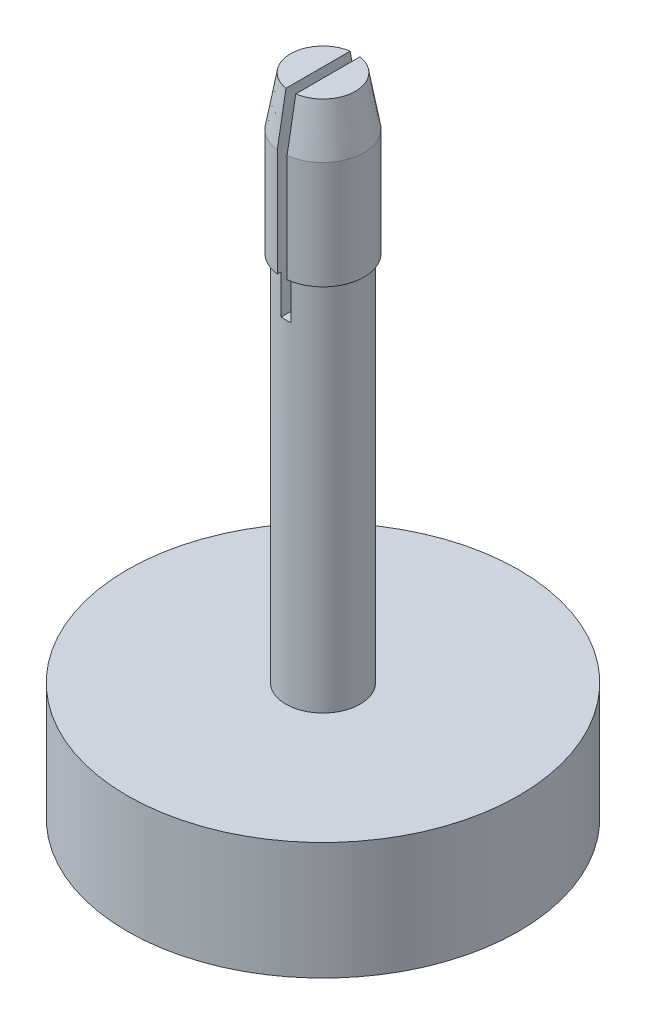
ISO-10303-21;
HEADER;
FILE_DESCRIPTION(('STEP AP214'),'2;1');
FILE_NAME('part.step','',(''),(''),'','','');
FILE_SCHEMA(('AUTOMOTIVE_DESIGN { 1 0 10303 214 1 1 1 1 }'));
ENDSEC;
DATA;
#1=APPLICATION_CONTEXT('core data for automotive mechanical design processes');
#2=APPLICATION_PROTOCOL_DEFINITION('international standard','automotive_design',2000,#1);
#3=PRODUCT_CONTEXT('',#1,'mechanical');
#4=PRODUCT('Part','Part','',(#3));
#5=PRODUCT_RELATED_PRODUCT_CATEGORY('part','',(#4));
#6=PRODUCT_DEFINITION_FORMATION('','',#4);
#7=PRODUCT_DEFINITION_CONTEXT('part definition',#1,'design');
#8=PRODUCT_DEFINITION('design','',#6,#7);
#9=PRODUCT_DEFINITION_SHAPE('','',#8);
#10=(LENGTH_UNIT() NAMED_UNIT(*) SI_UNIT(.MILLI.,.METRE.));
#11=(NAMED_UNIT(*) PLANE_ANGLE_UNIT() SI_UNIT($,.RADIAN.));
#12=(NAMED_UNIT(*) SI_UNIT($,.STERADIAN.) SOLID_ANGLE_UNIT());
#13=UNCERTAINTY_MEASURE_WITH_UNIT(LENGTH_MEASURE(1.E-05),#10,'distance_accuracy_value','');
#14=(GEOMETRIC_REPRESENTATION_CONTEXT(3) GLOBAL_UNCERTAINTY_ASSIGNED_CONTEXT((#13)) GLOBAL_UNIT_ASSIGNED_CONTEXT((#10,
#11,#12)) REPRESENTATION_CONTEXT('',''));
#15=CARTESIAN_POINT('',(0.,0.,0.));
#16=DIRECTION('',(0.,0.,1.));
#17=DIRECTION('',(1.,0.,0.));
#18=AXIS2_PLACEMENT_3D('',#15,#16,#17);
#19=CARTESIAN_POINT('',(0.,16.5,0.));
#20=DIRECTION('',(0.,-1.,0.));
#21=DIRECTION('',(0.,0.,-1.));
#22=AXIS2_PLACEMENT_3D('',#19,#20,#21);
#23=CYLINDRICAL_SURFACE('',#22,1.05);
#24=CARTESIAN_POINT('',(0.,15.25,0.));
#25=DIRECTION('',(0.,1.,0.));
#26=DIRECTION('',(0.,0.,1.));
#27=AXIS2_PLACEMENT_3D('',#24,#25,#26);
#28=CIRCLE('',#27,1.05);
#29=CARTESIAN_POINT('',(-0.125,15.25,1.04253297309965));
#30=VERTEX_POINT('',#29);
#31=CARTESIAN_POINT('',(-0.125,15.25,-1.04253297309965));
#32=VERTEX_POINT('',#31);
#33=EDGE_CURVE('E155',#30,#32,#28,.F.);
#34=ORIENTED_EDGE('',*,*,#33,.T.);
#35=DIRECTION('',(0.,-1.,0.));
#36=VECTOR('',#35,1.);
#37=CARTESIAN_POINT('',(-0.125,16.5,-1.04253297309965));
#38=LINE('',#37,#36);
#39=CARTESIAN_POINT('',(-0.125,12.5,-1.04253297309965));
#40=VERTEX_POINT('',#39);
#41=EDGE_CURVE('E123',#32,#40,#38,.T.);
#42=ORIENTED_EDGE('',*,*,#41,.T.);
#43=CARTESIAN_POINT('',(0.,12.5,0.));
#44=DIRECTION('',(0.,1.,0.));
#45=DIRECTION('',(0.,0.,1.));
#46=AXIS2_PLACEMENT_3D('',#43,#44,#45);
#47=CIRCLE('',#46,1.05);
#48=CARTESIAN_POINT('',(-0.125,12.5,1.04253297309965));
#49=VERTEX_POINT('',#48);
#50=EDGE_CURVE('E249',#40,#49,#47,.T.);
#51=ORIENTED_EDGE('',*,*,#50,.T.);
#52=DIRECTION('',(0.,-1.,0.));
#53=VECTOR('',#52,1.);
#54=CARTESIAN_POINT('',(-0.125,16.5,1.04253297309965));
#55=LINE('',#54,#53);
#56=EDGE_CURVE('E244',#49,#30,#55,.F.);
#57=ORIENTED_EDGE('',*,*,#56,.T.);
#58=EDGE_LOOP('',(#34,#42,#51,#57));
#59=FACE_BOUND('',#58,.T.);
#60=ADVANCED_FACE('F39',(#59),#23,.T.);
#61=CARTESIAN_POINT('',(0.,16.5,0.));
#62=DIRECTION('',(0.,1.,0.));
#63=DIRECTION('',(0.,0.,1.));
#64=AXIS2_PLACEMENT_3D('',#61,#62,#63);
#65=PLANE('',#64);
#66=DIRECTION('',(0.,0.,1.));
#67=VECTOR('',#66,1.);
#68=CARTESIAN_POINT('',(-0.125,16.5,-1.5));
#69=LINE('',#68,#67);
#70=CARTESIAN_POINT('',(-0.125,16.5,-0.82011991933301));
#71=VERTEX_POINT('',#70);
#72=CARTESIAN_POINT('',(-0.125,16.5,0.82011991933301));
#73=VERTEX_POINT('',#72);
#74=EDGE_CURVE('E120',#71,#73,#69,.T.);
#75=ORIENTED_EDGE('',*,*,#74,.F.);
#76=CARTESIAN_POINT('',(0.,16.5,0.));
#77=DIRECTION('',(0.,1.,0.));
#78=DIRECTION('',(0.,0.,1.));
#79=AXIS2_PLACEMENT_3D('',#76,#77,#78);
#80=CIRCLE('',#79,0.829591274114418);
#81=EDGE_CURVE('E135',#71,#73,#80,.T.);
#82=ORIENTED_EDGE('',*,*,#81,.T.);
#83=EDGE_LOOP('',(#75,#82));
#84=FACE_BOUND('',#83,.T.);
#85=ADVANCED_FACE('F134',(#84),#65,.T.);
#86=CARTESIAN_POINT('',(0.,12.5,0.));
#87=DIRECTION('',(0.,1.,0.));
#88=DIRECTION('',(0.,0.,1.));
#89=AXIS2_PLACEMENT_3D('',#86,#87,#88);
#90=PLANE('',#89);
#91=ORIENTED_EDGE('',*,*,#50,.F.);
#92=DIRECTION('',(0.,0.,1.));
#93=VECTOR('',#92,1.);
#94=CARTESIAN_POINT('',(-0.125,12.5,0.));
#95=LINE('',#94,#93);
#96=CARTESIAN_POINT('',(-0.125,12.5,-0.941740410091868));
#97=VERTEX_POINT('',#96);
#98=EDGE_CURVE('E239',#40,#97,#95,.T.);
#99=ORIENTED_EDGE('',*,*,#98,.T.);
#100=CARTESIAN_POINT('',(0.,12.5,0.));
#101=DIRECTION('',(0.,1.,0.));
#102=DIRECTION('',(0.,0.,1.));
#103=AXIS2_PLACEMENT_3D('',#100,#101,#102);
#104=CIRCLE('',#103,0.95);
#105=CARTESIAN_POINT('',(-0.125,12.5,0.941740410091868));
#106=VERTEX_POINT('',#105);
#107=EDGE_CURVE('E254',#97,#106,#104,.T.);
#108=ORIENTED_EDGE('',*,*,#107,.T.);
#109=EDGE_CURVE('E64',#106,#49,#95,.T.);
#110=ORIENTED_EDGE('',*,*,#109,.T.);
#111=EDGE_LOOP('',(#91,#99,#108,#110));
#112=FACE_BOUND('',#111,.T.);
#113=ADVANCED_FACE('F285',(#112),#90,.F.);
#114=CARTESIAN_POINT('',(0.,16.5,0.));
#115=DIRECTION('',(0.,-1.,0.));
#116=DIRECTION('',(0.,0.,-1.));
#117=AXIS2_PLACEMENT_3D('',#114,#115,#116);
#118=CONICAL_SURFACE('',#117,0.829591274114418,0.174532925199429);
#119=CARTESIAN_POINT('',(-0.125,18.94406988197,0.378530725252323));
#120=CARTESIAN_POINT('',(-0.125,18.832752243388,0.399192830328894));
#121=CARTESIAN_POINT('',(-0.125,18.721408295903,0.419712228066009));
#122=CARTESIAN_POINT('',(-0.125,18.4986822676716,0.460541771400634));
#123=CARTESIAN_POINT('',(-0.125,18.3873001870088,0.480851917454275));
#124=CARTESIAN_POINT('',(-0.125,18.0531178660346,0.541582833124006));
#125=CARTESIAN_POINT('',(-0.125,17.8302814244017,0.581804102782841));
#126=CARTESIAN_POINT('',(-0.125,17.3845580422133,0.661966043324755));
#127=CARTESIAN_POINT('',(-0.125,17.1616711016276,0.701906714039098));
#128=CARTESIAN_POINT('',(-0.125,16.4929646603575,0.821484275084629));
#129=CARTESIAN_POINT('',(-0.125,16.0471014091611,0.900876377280123));
#130=CARTESIAN_POINT('',(-0.125,15.1353695414359,1.06293655947568));
#131=CARTESIAN_POINT('',(-0.125,14.66949872161,1.14559221954829));
#132=CARTESIAN_POINT('',(-0.125,13.7377300797798,1.31073031392189));
#133=CARTESIAN_POINT('',(-0.125,13.2718322580116,1.3932127495542));
#134=CARTESIAN_POINT('',(-0.125,12.80593011803,1.47567072315508));
#135=B_SPLINE_CURVE_WITH_KNOTS('',3,(#119,#120,#121,#122,#123,#124,#125,#126,#127,#128,#129,
#130,#131,#132,#133,#134),.UNSPECIFIED.,.F.,.F.,(4,2,2,2,2,2,2,4),(0.,0.339656618367972,
0.679312496187563,1.35862387864699,2.03793566957125,3.39656494885461,4.81600434101302,
6.2354327838903),.UNSPECIFIED.);
#136=EDGE_CURVE('E129',#73,#30,#135,.T.);
#137=ORIENTED_EDGE('',*,*,#136,.F.);
#138=ORIENTED_EDGE('',*,*,#81,.F.);
#139=CARTESIAN_POINT('',(-0.125,12.80593011803,-1.47567072315508));
#140=CARTESIAN_POINT('',(-0.125,13.2201070563063,-1.4023694037936));
#141=CARTESIAN_POINT('',(-0.125,13.6342802173729,-1.32904656943531));
#142=CARTESIAN_POINT('',(-0.125,14.4626036346338,-1.18227467515865));
#143=CARTESIAN_POINT('',(-0.125,14.876753890856,-1.10882561539832));
#144=CARTESIAN_POINT('',(-0.125,15.5954316179734,-0.981181368340248));
#145=CARTESIAN_POINT('',(-0.125,15.8999676345108,-0.92703430712558));
#146=CARTESIAN_POINT('',(-0.125,16.5090057332859,-0.818550746913011));
#147=CARTESIAN_POINT('',(-0.125,16.8135078155479,-0.764214248051819));
#148=CARTESIAN_POINT('',(-0.125,17.2702139621117,-0.682444215382));
#149=CARTESIAN_POINT('',(-0.125,17.4224417534576,-0.655143280751386));
#150=CARTESIAN_POINT('',(-0.125,17.7268735269412,-0.600409482877401));
#151=CARTESIAN_POINT('',(-0.125,17.8790775090922,-0.572976619707431));
#152=CARTESIAN_POINT('',(-0.125,18.1834514608506,-0.517919826766804));
#153=CARTESIAN_POINT('',(-0.125,18.3356214303588,-0.490295896446679));
#154=CARTESIAN_POINT('',(-0.125,18.639899282752,-0.434706786471484));
#155=CARTESIAN_POINT('',(-0.125,18.7920071655119,-0.406741606132946));
#156=CARTESIAN_POINT('',(-0.125,18.94406988197,-0.378530725252323));
#157=B_SPLINE_CURVE_WITH_KNOTS('',3,(#139,#140,#141,#142,#143,#144,#145,#146,#147,#148,#149,
#150,#151,#152,#153,#154,#155,#156),.UNSPECIFIED.,.F.,.F.,(4,2,2,2,2,2,2,2,4),(0.,
1.26184020439334,2.52367883016235,3.4516156602621,4.37955182084626,4.84352135598511,
5.30749063301698,5.77146124487809,6.23543278614986),.UNSPECIFIED.);
#158=EDGE_CURVE('E116',#32,#71,#157,.T.);
#159=ORIENTED_EDGE('',*,*,#158,.F.);
#160=ORIENTED_EDGE('',*,*,#33,.F.);
#161=EDGE_LOOP('',(#137,#138,#159,#160));
#162=FACE_BOUND('',#161,.T.);
#163=ADVANCED_FACE('F139',(#162),#118,.T.);
#164=CARTESIAN_POINT('',(0.,3.,0.));
#165=DIRECTION('',(0.,-1.,0.));
#166=DIRECTION('',(0.,0.,-1.));
#167=AXIS2_PLACEMENT_3D('',#164,#165,#166);
#168=CYLINDRICAL_SURFACE('',#167,5.);
#169=CARTESIAN_POINT('',(0.,3.,0.));
#170=DIRECTION('',(0.,1.,0.));
#171=DIRECTION('',(0.,0.,1.));
#172=AXIS2_PLACEMENT_3D('',#169,#170,#171);
#173=CIRCLE('',#172,5.);
#174=CARTESIAN_POINT('',(0.,3.,5.));
#175=VERTEX_POINT('',#174);
#176=EDGE_CURVE('E149',#175,#175,#173,.T.);
#177=ORIENTED_EDGE('',*,*,#176,.F.);
#178=EDGE_LOOP('',(#177));
#179=FACE_BOUND('',#178,.T.);
#180=CARTESIAN_POINT('',(0.,0.,0.));
#181=DIRECTION('',(0.,1.,0.));
#182=DIRECTION('',(0.,0.,1.));
#183=AXIS2_PLACEMENT_3D('',#180,#181,#182);
#184=CIRCLE('',#183,5.);
#185=CARTESIAN_POINT('',(0.,0.,5.));
#186=VERTEX_POINT('',#185);
#187=EDGE_CURVE('E153',#186,#186,#184,.T.);
#188=ORIENTED_EDGE('',*,*,#187,.T.);
#189=EDGE_LOOP('',(#188));
#190=FACE_BOUND('',#189,.T.);
#191=ADVANCED_FACE('F265',(#179,#190),#168,.T.);
#192=CARTESIAN_POINT('',(0.,3.,0.));
#193=DIRECTION('',(0.,1.,0.));
#194=DIRECTION('',(0.,0.,1.));
#195=AXIS2_PLACEMENT_3D('',#192,#193,#194);
#196=PLANE('',#195);
#197=CARTESIAN_POINT('',(0.,3.,0.));
#198=DIRECTION('',(0.,1.,0.));
#199=DIRECTION('',(0.,0.,1.));
#200=AXIS2_PLACEMENT_3D('',#197,#198,#199);
#201=CIRCLE('',#200,0.95);
#202=CARTESIAN_POINT('',(0.,3.,0.95));
#203=VERTEX_POINT('',#202);
#204=EDGE_CURVE('E142',#203,#203,#201,.T.);
#205=ORIENTED_EDGE('',*,*,#204,.F.);
#206=EDGE_LOOP('',(#205));
#207=FACE_BOUND('',#206,.T.);
#208=ORIENTED_EDGE('',*,*,#176,.T.);
#209=EDGE_LOOP('',(#208));
#210=FACE_BOUND('',#209,.T.);
#211=ADVANCED_FACE('F269',(#207,#210),#196,.T.);
#212=CARTESIAN_POINT('',(0.,0.,0.));
#213=DIRECTION('',(0.,1.,0.));
#214=DIRECTION('',(0.,0.,1.));
#215=AXIS2_PLACEMENT_3D('',#212,#213,#214);
#216=PLANE('',#215);
#217=ORIENTED_EDGE('',*,*,#187,.F.);
#218=EDGE_LOOP('',(#217));
#219=FACE_BOUND('',#218,.T.);
#220=ADVANCED_FACE('F267',(#219),#216,.F.);
#221=CARTESIAN_POINT('',(0.,12.5,0.));
#222=DIRECTION('',(0.,-1.,0.));
#223=DIRECTION('',(0.,0.,-1.));
#224=AXIS2_PLACEMENT_3D('',#221,#222,#223);
#225=CYLINDRICAL_SURFACE('',#224,0.95);
#226=CARTESIAN_POINT('',(0.,11.5,0.));
#227=DIRECTION('',(0.,-1.,0.));
#228=DIRECTION('',(0.,0.,-1.));
#229=AXIS2_PLACEMENT_3D('',#226,#227,#228);
#230=CIRCLE('',#229,0.95);
#231=CARTESIAN_POINT('',(0.125,11.5,0.941740410091868));
#232=VERTEX_POINT('',#231);
#233=CARTESIAN_POINT('',(-0.125,11.5,0.941740410091868));
#234=VERTEX_POINT('',#233);
#235=EDGE_CURVE('E11',#232,#234,#230,.T.);
#236=ORIENTED_EDGE('',*,*,#235,.T.);
#237=DIRECTION('',(0.,-1.,0.));
#238=VECTOR('',#237,1.);
#239=CARTESIAN_POINT('',(-0.125,12.5,0.941740410091868));
#240=LINE('',#239,#238);
#241=EDGE_CURVE('E212',#234,#106,#240,.F.);
#242=ORIENTED_EDGE('',*,*,#241,.T.);
#243=ORIENTED_EDGE('',*,*,#107,.F.);
#244=DIRECTION('',(0.,-1.,0.));
#245=VECTOR('',#244,1.);
#246=CARTESIAN_POINT('',(-0.125,12.5,-0.941740410091868));
#247=LINE('',#246,#245);
#248=CARTESIAN_POINT('',(-0.125,11.5,-0.941740410091868));
#249=VERTEX_POINT('',#248);
#250=EDGE_CURVE('E204',#97,#249,#247,.T.);
#251=ORIENTED_EDGE('',*,*,#250,.T.);
#252=CARTESIAN_POINT('',(0.125,11.5,-0.941740410091868));
#253=VERTEX_POINT('',#252);
#254=EDGE_CURVE('E44',#249,#253,#230,.T.);
#255=ORIENTED_EDGE('',*,*,#254,.T.);
#256=DIRECTION('',(0.,-1.,0.));
#257=VECTOR('',#256,1.);
#258=CARTESIAN_POINT('',(0.125,12.5,-0.941740410091868));
#259=LINE('',#258,#257);
#260=CARTESIAN_POINT('',(0.125,12.5,-0.941740410091868));
#261=VERTEX_POINT('',#260);
#262=EDGE_CURVE('E201',#253,#261,#259,.F.);
#263=ORIENTED_EDGE('',*,*,#262,.T.);
#264=CARTESIAN_POINT('',(0.125,12.5,0.941740410091868));
#265=VERTEX_POINT('',#264);
#266=EDGE_CURVE('E255',#265,#261,#104,.T.);
#267=ORIENTED_EDGE('',*,*,#266,.F.);
#268=DIRECTION('',(0.,-1.,0.));
#269=VECTOR('',#268,1.);
#270=CARTESIAN_POINT('',(0.125,12.5,0.941740410091868));
#271=LINE('',#270,#269);
#272=EDGE_CURVE('E226',#265,#232,#271,.T.);
#273=ORIENTED_EDGE('',*,*,#272,.T.);
#274=EDGE_LOOP('',(#236,#242,#243,#251,#255,#263,#267,#273));
#275=FACE_BOUND('',#274,.T.);
#276=ORIENTED_EDGE('',*,*,#204,.T.);
#277=EDGE_LOOP('',(#276));
#278=FACE_BOUND('',#277,.T.);
#279=ADVANCED_FACE('F198',(#275,#278),#225,.T.);
#280=CARTESIAN_POINT('',(0.125,15.25,-1.04253297309965));
#281=VERTEX_POINT('',#280);
#282=CARTESIAN_POINT('',(0.125,15.25,1.04253297309965));
#283=VERTEX_POINT('',#282);
#284=EDGE_CURVE('E147',#281,#283,#28,.F.);
#285=ORIENTED_EDGE('',*,*,#284,.T.);
#286=DIRECTION('',(0.,-1.,0.));
#287=VECTOR('',#286,1.);
#288=CARTESIAN_POINT('',(0.125,16.5,1.04253297309965));
#289=LINE('',#288,#287);
#290=CARTESIAN_POINT('',(0.125,12.5,1.04253297309965));
#291=VERTEX_POINT('',#290);
#292=EDGE_CURVE('E56',#283,#291,#289,.T.);
#293=ORIENTED_EDGE('',*,*,#292,.T.);
#294=CARTESIAN_POINT('',(0.125,12.5,-1.04253297309965));
#295=VERTEX_POINT('',#294);
#296=EDGE_CURVE('E250',#291,#295,#47,.T.);
#297=ORIENTED_EDGE('',*,*,#296,.T.);
#298=DIRECTION('',(0.,-1.,0.));
#299=VECTOR('',#298,1.);
#300=CARTESIAN_POINT('',(0.125,16.5,-1.04253297309965));
#301=LINE('',#300,#299);
#302=EDGE_CURVE('E231',#295,#281,#301,.F.);
#303=ORIENTED_EDGE('',*,*,#302,.T.);
#304=EDGE_LOOP('',(#285,#293,#297,#303));
#305=FACE_BOUND('',#304,.T.);
#306=ADVANCED_FACE('F275',(#305),#23,.T.);
#307=DIRECTION('',(0.,0.,-1.));
#308=VECTOR('',#307,1.);
#309=CARTESIAN_POINT('',(0.125,16.5,-1.5));
#310=LINE('',#309,#308);
#311=CARTESIAN_POINT('',(0.125,16.5,0.82011991933301));
#312=VERTEX_POINT('',#311);
#313=CARTESIAN_POINT('',(0.125,16.5,-0.82011991933301));
#314=VERTEX_POINT('',#313);
#315=EDGE_CURVE('E137',#312,#314,#310,.T.);
#316=ORIENTED_EDGE('',*,*,#315,.F.);
#317=EDGE_CURVE('E141',#312,#314,#80,.T.);
#318=ORIENTED_EDGE('',*,*,#317,.T.);
#319=EDGE_LOOP('',(#316,#318));
#320=FACE_BOUND('',#319,.T.);
#321=ADVANCED_FACE('F180',(#320),#65,.T.);
#322=ORIENTED_EDGE('',*,*,#296,.F.);
#323=DIRECTION('',(0.,0.,-1.));
#324=VECTOR('',#323,1.);
#325=CARTESIAN_POINT('',(0.125,12.5,0.));
#326=LINE('',#325,#324);
#327=EDGE_CURVE('E222',#291,#265,#326,.T.);
#328=ORIENTED_EDGE('',*,*,#327,.T.);
#329=ORIENTED_EDGE('',*,*,#266,.T.);
#330=EDGE_CURVE('E227',#261,#295,#326,.T.);
#331=ORIENTED_EDGE('',*,*,#330,.T.);
#332=EDGE_LOOP('',(#322,#328,#329,#331));
#333=FACE_BOUND('',#332,.T.);
#334=ADVANCED_FACE('F291',(#333),#90,.F.);
#335=CARTESIAN_POINT('',(0.125,18.94406988197,-0.378530725252323));
#336=CARTESIAN_POINT('',(0.125,18.832752243388,-0.399192830328894));
#337=CARTESIAN_POINT('',(0.125,18.721408295903,-0.419712228066009));
#338=CARTESIAN_POINT('',(0.125,18.4986822676716,-0.460541771400634));
#339=CARTESIAN_POINT('',(0.125,18.3873001870088,-0.480851917454275));
#340=CARTESIAN_POINT('',(0.125,18.0531178660346,-0.541582833124006));
#341=CARTESIAN_POINT('',(0.125,17.8302814244017,-0.581804102782841));
#342=CARTESIAN_POINT('',(0.125,17.3845580422133,-0.661966043324755));
#343=CARTESIAN_POINT('',(0.125,17.1616711016276,-0.701906714039098));
#344=CARTESIAN_POINT('',(0.125,16.4929646603575,-0.821484275084629));
#345=CARTESIAN_POINT('',(0.125,16.0471014091611,-0.900876377280123));
#346=CARTESIAN_POINT('',(0.125,15.1353695414359,-1.06293655947568));
#347=CARTESIAN_POINT('',(0.125,14.66949872161,-1.14559221954829));
#348=CARTESIAN_POINT('',(0.125,13.7377300797798,-1.31073031392189));
#349=CARTESIAN_POINT('',(0.125,13.2718322580116,-1.3932127495542));
#350=CARTESIAN_POINT('',(0.125,12.80593011803,-1.47567072315508));
#351=B_SPLINE_CURVE_WITH_KNOTS('',3,(#335,#336,#337,#338,#339,#340,#341,#342,#343,#344,#345,
#346,#347,#348,#349,#350),.UNSPECIFIED.,.F.,.F.,(4,2,2,2,2,2,2,4),(0.,0.339656618367972,
0.679312496187563,1.35862387864699,2.03793566957125,3.39656494885461,4.81600434101302,
6.2354327838903),.UNSPECIFIED.);
#352=EDGE_CURVE('E130',#314,#281,#351,.T.);
#353=ORIENTED_EDGE('',*,*,#352,.F.);
#354=ORIENTED_EDGE('',*,*,#317,.F.);
#355=CARTESIAN_POINT('',(0.125,12.80593011803,1.47567072315508));
#356=CARTESIAN_POINT('',(0.125,13.2201070563063,1.4023694037936));
#357=CARTESIAN_POINT('',(0.125,13.6342802173729,1.32904656943531));
#358=CARTESIAN_POINT('',(0.125,14.4626036346338,1.18227467515865));
#359=CARTESIAN_POINT('',(0.125,14.876753890856,1.10882561539832));
#360=CARTESIAN_POINT('',(0.125,15.5954316179734,0.981181368340248));
#361=CARTESIAN_POINT('',(0.125,15.8999676345108,0.92703430712558));
#362=CARTESIAN_POINT('',(0.125,16.5090057332859,0.818550746913011));
#363=CARTESIAN_POINT('',(0.125,16.8135078155479,0.764214248051819));
#364=CARTESIAN_POINT('',(0.125,17.2702139621117,0.682444215382));
#365=CARTESIAN_POINT('',(0.125,17.4224417534576,0.655143280751386));
#366=CARTESIAN_POINT('',(0.125,17.7268735269412,0.600409482877401));
#367=CARTESIAN_POINT('',(0.125,17.8790775090922,0.572976619707431));
#368=CARTESIAN_POINT('',(0.125,18.1834514608506,0.517919826766804));
#369=CARTESIAN_POINT('',(0.125,18.3356214303588,0.490295896446679));
#370=CARTESIAN_POINT('',(0.125,18.639899282752,0.434706786471484));
#371=CARTESIAN_POINT('',(0.125,18.7920071655119,0.406741606132946));
#372=CARTESIAN_POINT('',(0.125,18.94406988197,0.378530725252323));
#373=B_SPLINE_CURVE_WITH_KNOTS('',3,(#355,#356,#357,#358,#359,#360,#361,#362,#363,#364,#365,
#366,#367,#368,#369,#370,#371,#372),.UNSPECIFIED.,.F.,.F.,(4,2,2,2,2,2,2,2,4),(0.,
1.26184020439334,2.52367883016235,3.4516156602621,4.37955182084626,4.84352135598511,
5.30749063301698,5.77146124487809,6.23543278614986),.UNSPECIFIED.);
#374=EDGE_CURVE('E158',#283,#312,#373,.T.);
#375=ORIENTED_EDGE('',*,*,#374,.F.);
#376=ORIENTED_EDGE('',*,*,#284,.F.);
#377=EDGE_LOOP('',(#353,#354,#375,#376));
#378=FACE_BOUND('',#377,.T.);
#379=ADVANCED_FACE('F41',(#378),#118,.T.);
#380=CARTESIAN_POINT('',(0.,11.5,0.));
#381=DIRECTION('',(0.,-1.,0.));
#382=DIRECTION('',(0.,0.,-1.));
#383=AXIS2_PLACEMENT_3D('',#380,#381,#382);
#384=PLANE('',#383);
#385=DIRECTION('',(0.,0.,-1.));
#386=VECTOR('',#385,1.);
#387=CARTESIAN_POINT('',(0.125,11.5,-1.5));
#388=LINE('',#387,#386);
#389=EDGE_CURVE('E210',#232,#253,#388,.T.);
#390=ORIENTED_EDGE('',*,*,#389,.T.);
#391=ORIENTED_EDGE('',*,*,#254,.F.);
#392=DIRECTION('',(0.,0.,1.));
#393=VECTOR('',#392,1.);
#394=CARTESIAN_POINT('',(-0.125,11.5,-1.5));
#395=LINE('',#394,#393);
#396=EDGE_CURVE('E208',#249,#234,#395,.T.);
#397=ORIENTED_EDGE('',*,*,#396,.T.);
#398=ORIENTED_EDGE('',*,*,#235,.F.);
#399=EDGE_LOOP('',(#390,#391,#397,#398));
#400=FACE_BOUND('',#399,.T.);
#401=ADVANCED_FACE('F175',(#400),#384,.F.);
#402=CARTESIAN_POINT('',(-0.125,11.5,-1.5));
#403=DIRECTION('',(-1.,0.,0.));
#404=DIRECTION('',(0.,0.,1.));
#405=AXIS2_PLACEMENT_3D('',#402,#403,#404);
#406=PLANE('',#405);
#407=ORIENTED_EDGE('',*,*,#396,.F.);
#408=ORIENTED_EDGE('',*,*,#250,.F.);
#409=ORIENTED_EDGE('',*,*,#98,.F.);
#410=ORIENTED_EDGE('',*,*,#41,.F.);
#411=ORIENTED_EDGE('',*,*,#158,.T.);
#412=ORIENTED_EDGE('',*,*,#74,.T.);
#413=ORIENTED_EDGE('',*,*,#136,.T.);
#414=ORIENTED_EDGE('',*,*,#56,.F.);
#415=ORIENTED_EDGE('',*,*,#109,.F.);
#416=ORIENTED_EDGE('',*,*,#241,.F.);
#417=EDGE_LOOP('',(#407,#408,#409,#410,#411,#412,#413,#414,#415,#416));
#418=FACE_BOUND('',#417,.T.);
#419=ADVANCED_FACE('F119',(#418),#406,.F.);
#420=CARTESIAN_POINT('',(0.125,11.5,-1.5));
#421=DIRECTION('',(1.,0.,0.));
#422=DIRECTION('',(0.,0.,-1.));
#423=AXIS2_PLACEMENT_3D('',#420,#421,#422);
#424=PLANE('',#423);
#425=ORIENTED_EDGE('',*,*,#389,.F.);
#426=ORIENTED_EDGE('',*,*,#272,.F.);
#427=ORIENTED_EDGE('',*,*,#327,.F.);
#428=ORIENTED_EDGE('',*,*,#292,.F.);
#429=ORIENTED_EDGE('',*,*,#374,.T.);
#430=ORIENTED_EDGE('',*,*,#315,.T.);
#431=ORIENTED_EDGE('',*,*,#352,.T.);
#432=ORIENTED_EDGE('',*,*,#302,.F.);
#433=ORIENTED_EDGE('',*,*,#330,.F.);
#434=ORIENTED_EDGE('',*,*,#262,.F.);
#435=EDGE_LOOP('',(#425,#426,#427,#428,#429,#430,#431,#432,#433,#434));
#436=FACE_BOUND('',#435,.T.);
#437=ADVANCED_FACE('F170',(#436),#424,.F.);
#438=CLOSED_SHELL('',(#60,#85,#113,#163,#191,#211,#220,#279,#306,#321,#334,#379,#401,#419,#437));
#439=MANIFOLD_SOLID_BREP('B2',#438);
#440=ADVANCED_BREP_SHAPE_REPRESENTATION('',(#18,#439),#14);
#441=SHAPE_DEFINITION_REPRESENTATION(#9,#440);
ENDSEC;
END-ISO-10303-21;
